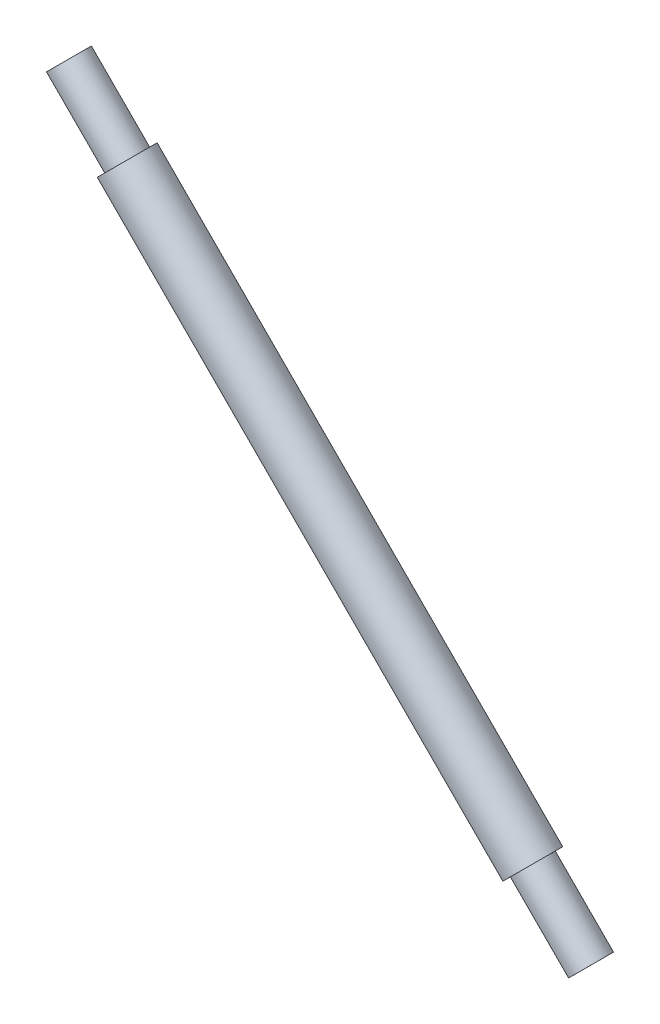
ISO-10303-21;
HEADER;
FILE_DESCRIPTION(('STEP AP214'),'2;1');
FILE_NAME('part.step','',(''),(''),'','','');
FILE_SCHEMA(('AUTOMOTIVE_DESIGN { 1 0 10303 214 1 1 1 1 }'));
ENDSEC;
DATA;
#1=APPLICATION_CONTEXT('core data for automotive mechanical design processes');
#2=APPLICATION_PROTOCOL_DEFINITION('international standard','automotive_design',2000,#1);
#3=PRODUCT_CONTEXT('',#1,'mechanical');
#4=PRODUCT('Part','Part','',(#3));
#5=PRODUCT_RELATED_PRODUCT_CATEGORY('part','',(#4));
#6=PRODUCT_DEFINITION_FORMATION('','',#4);
#7=PRODUCT_DEFINITION_CONTEXT('part definition',#1,'design');
#8=PRODUCT_DEFINITION('design','',#6,#7);
#9=PRODUCT_DEFINITION_SHAPE('','',#8);
#10=(LENGTH_UNIT() NAMED_UNIT(*) SI_UNIT(.MILLI.,.METRE.));
#11=(NAMED_UNIT(*) PLANE_ANGLE_UNIT() SI_UNIT($,.RADIAN.));
#12=(NAMED_UNIT(*) SI_UNIT($,.STERADIAN.) SOLID_ANGLE_UNIT());
#13=UNCERTAINTY_MEASURE_WITH_UNIT(LENGTH_MEASURE(1.E-05),#10,'distance_accuracy_value','');
#14=(GEOMETRIC_REPRESENTATION_CONTEXT(3) GLOBAL_UNCERTAINTY_ASSIGNED_CONTEXT((#13)) GLOBAL_UNIT_ASSIGNED_CONTEXT((#10,
#11,#12)) REPRESENTATION_CONTEXT('',''));
#15=CARTESIAN_POINT('',(0.,0.,0.));
#16=DIRECTION('',(0.,0.,1.));
#17=DIRECTION('',(1.,0.,0.));
#18=AXIS2_PLACEMENT_3D('',#15,#16,#17);
#19=CARTESIAN_POINT('',(22.08105341974,-43.79049818765,-55.53182131977));
#20=DIRECTION('',(-0.707105990185642,0.707106781186183,-0.00105765972682995));
#21=DIRECTION('',(-0.654896304311471,-0.654330019279172,0.378104557588633));
#22=AXIS2_PLACEMENT_3D('',#19,#20,#21);
#23=PLANE('',#22);
#24=CARTESIAN_POINT('',(21.46883138841,-44.399632374965,-53.4678766290032));
#25=DIRECTION('',(-0.707105990185913,0.707106781185907,-0.00105765972997965));
#26=DIRECTION('',(-0.707107176686655,-0.707106385686219,0.));
#27=AXIS2_PLACEMENT_3D('',#24,#25,#26);
#28=CIRCLE('',#27,1.4999999999924);
#29=CARTESIAN_POINT('',(20.4081706233854,-45.460291953489,-53.4678766290032));
#30=VERTEX_POINT('',#29);
#31=EDGE_CURVE('E19',#30,#30,#28,.F.);
#32=ORIENTED_EDGE('',*,*,#31,.T.);
#33=EDGE_LOOP('',(#32));
#34=FACE_BOUND('',#33,.T.);
#35=ADVANCED_FACE('F15',(#34),#23,.F.);
#36=CARTESIAN_POINT('',(21.46883138841,-44.399632374965,-53.4678766290032));
#37=DIRECTION('',(-0.707105990185913,0.707106781185907,-0.00105765972997965));
#38=DIRECTION('',(-0.707107176686655,-0.707106385686219,0.));
#39=AXIS2_PLACEMENT_3D('',#36,#37,#38);
#40=CYLINDRICAL_SURFACE('',#39,1.4999999999924);
#41=CARTESIAN_POINT('',(16.6958659546553,-39.6266616019604,-53.4750158321806));
#42=DIRECTION('',(-0.707105990185913,0.707106781185907,-0.00105765972997965));
#43=DIRECTION('',(-0.707107176686655,-0.707106385686219,0.));
#44=AXIS2_PLACEMENT_3D('',#41,#42,#43);
#45=CIRCLE('',#44,1.4999999999924);
#46=CARTESIAN_POINT('',(15.6352051896307,-40.6873211804843,-53.4750158321806));
#47=VERTEX_POINT('',#46);
#48=EDGE_CURVE('E35',#47,#47,#45,.F.);
#49=ORIENTED_EDGE('',*,*,#48,.T.);
#50=EDGE_LOOP('',(#49));
#51=FACE_BOUND('',#50,.T.);
#52=ORIENTED_EDGE('',*,*,#31,.F.);
#53=EDGE_LOOP('',(#52));
#54=FACE_BOUND('',#53,.T.);
#55=ADVANCED_FACE('F43',(#51,#54),#40,.T.);
#56=CARTESIAN_POINT('',(17.50338033227,-38.82320468432,-56.18705888336));
#57=DIRECTION('',(-0.707105990184378,0.707106781187443,-0.00105765972950245));
#58=DIRECTION('',(-0.654896304314092,-0.654330019278031,0.378104557586067));
#59=AXIS2_PLACEMENT_3D('',#56,#57,#58);
#60=PLANE('',#59);
#61=ORIENTED_EDGE('',*,*,#48,.F.);
#62=EDGE_LOOP('',(#61));
#63=FACE_BOUND('',#62,.T.);
#64=CARTESIAN_POINT('',(16.6958659546512,-39.6266616019562,-53.4750158321806));
#65=DIRECTION('',(-0.707105990185913,0.707106781185907,-0.00105765972997985));
#66=DIRECTION('',(-0.707107176686655,-0.707106385686219,0.));
#67=AXIS2_PLACEMENT_3D('',#64,#65,#66);
#68=CIRCLE('',#67,1.99999999996793);
#69=CARTESIAN_POINT('',(15.2816516013005,-41.040874373306,-53.4750158321806));
#70=VERTEX_POINT('',#69);
#71=EDGE_CURVE('E33',#70,#70,#68,.F.);
#72=ORIENTED_EDGE('',*,*,#71,.T.);
#73=EDGE_LOOP('',(#72));
#74=FACE_BOUND('',#73,.T.);
#75=ADVANCED_FACE('F45',(#63,#74),#60,.F.);
#76=CARTESIAN_POINT('',(16.6958659546512,-39.6266616019562,-53.4750158321806));
#77=DIRECTION('',(-0.707105990185913,0.707106781185907,-0.00105765972997985));
#78=DIRECTION('',(-0.707107176686655,-0.707106385686219,0.));
#79=AXIS2_PLACEMENT_3D('',#76,#77,#78);
#80=CYLINDRICAL_SURFACE('',#79,1.99999999996793);
#81=CARTESIAN_POINT('',(-16.5381155840854,-6.39264288621997,-53.5247258394896));
#82=DIRECTION('',(-0.707105990185913,0.707106781185907,-0.00105765972997985));
#83=DIRECTION('',(-0.707107176686655,-0.707106385686219,0.));
#84=AXIS2_PLACEMENT_3D('',#81,#82,#83);
#85=CIRCLE('',#84,1.99999999996793);
#86=CARTESIAN_POINT('',(-17.952329937436,-7.80685565756973,-53.5247258394896));
#87=VERTEX_POINT('',#86);
#88=EDGE_CURVE('E28',#87,#87,#85,.T.);
#89=ORIENTED_EDGE('',*,*,#88,.F.);
#90=EDGE_LOOP('',(#89));
#91=FACE_BOUND('',#90,.T.);
#92=ORIENTED_EDGE('',*,*,#71,.F.);
#93=EDGE_LOOP('',(#92));
#94=FACE_BOUND('',#93,.T.);
#95=ADVANCED_FACE('F52',(#91,#94),#80,.T.);
#96=CARTESIAN_POINT('',(-15.73060120644,-5.589185968545,-56.23676889065));
#97=DIRECTION('',(-0.707105990185382,0.70710678118644,-0.0010576597289218));
#98=DIRECTION('',(-0.65489630431282,-0.654330019278926,0.378104557586721));
#99=AXIS2_PLACEMENT_3D('',#96,#97,#98);
#100=PLANE('',#99);
#101=CARTESIAN_POINT('',(-16.5381155840887,-6.39264288621675,-53.5247258394896));
#102=DIRECTION('',(-0.707105990185917,0.707106781185904,-0.00105765972997731));
#103=DIRECTION('',(-0.707107176686651,-0.707106385686222,0.));
#104=AXIS2_PLACEMENT_3D('',#101,#102,#103);
#105=CIRCLE('',#104,1.4999999999513);
#106=CARTESIAN_POINT('',(-17.5987763490843,-7.45330246471165,-53.5247258394896));
#107=VERTEX_POINT('',#106);
#108=EDGE_CURVE('E23',#107,#107,#105,.F.);
#109=ORIENTED_EDGE('',*,*,#108,.T.);
#110=EDGE_LOOP('',(#109));
#111=FACE_BOUND('',#110,.T.);
#112=ORIENTED_EDGE('',*,*,#88,.T.);
#113=EDGE_LOOP('',(#112));
#114=FACE_BOUND('',#113,.T.);
#115=ADVANCED_FACE('F62',(#111,#114),#100,.T.);
#116=CARTESIAN_POINT('',(-16.5381155840887,-6.39264288621676,-53.5247258394896));
#117=DIRECTION('',(-0.707105990185917,0.707106781185904,-0.00105765972997731));
#118=DIRECTION('',(-0.707107176686651,-0.707106385686222,0.));
#119=AXIS2_PLACEMENT_3D('',#116,#117,#118);
#120=CYLINDRICAL_SURFACE('',#119,1.4999999999513);
#121=CARTESIAN_POINT('',(-21.3110810178439,-1.61967211321168,-53.5318650426669));
#122=DIRECTION('',(-0.707105990185917,0.707106781185904,-0.00105765972997731));
#123=DIRECTION('',(-0.707107176686651,-0.707106385686222,0.));
#124=AXIS2_PLACEMENT_3D('',#121,#122,#123);
#125=CIRCLE('',#124,1.4999999999513);
#126=CARTESIAN_POINT('',(-22.3717417828394,-2.68033169170657,-53.5318650426669));
#127=VERTEX_POINT('',#126);
#128=EDGE_CURVE('E10',#127,#127,#125,.T.);
#129=ORIENTED_EDGE('',*,*,#128,.F.);
#130=EDGE_LOOP('',(#129));
#131=FACE_BOUND('',#130,.T.);
#132=ORIENTED_EDGE('',*,*,#108,.F.);
#133=EDGE_LOOP('',(#132));
#134=FACE_BOUND('',#133,.T.);
#135=ADVANCED_FACE('F58',(#131,#134),#120,.T.);
#136=CARTESIAN_POINT('',(-20.69885898646,-1.010537925859,-55.59580973341));
#137=DIRECTION('',(-0.707105990185547,0.707106781186276,-0.00105765972828059));
#138=DIRECTION('',(-0.654896304311878,-0.654330019278629,0.378104557588868));
#139=AXIS2_PLACEMENT_3D('',#136,#137,#138);
#140=PLANE('',#139);
#141=ORIENTED_EDGE('',*,*,#128,.T.);
#142=EDGE_LOOP('',(#141));
#143=FACE_BOUND('',#142,.T.);
#144=ADVANCED_FACE('F17',(#143),#140,.T.);
#145=CLOSED_SHELL('',(#35,#55,#75,#95,#115,#135,#144));
#146=MANIFOLD_SOLID_BREP('B1',#145);
#147=ADVANCED_BREP_SHAPE_REPRESENTATION('',(#18,#146),#14);
#148=SHAPE_DEFINITION_REPRESENTATION(#9,#147);
ENDSEC;
END-ISO-10303-21;
